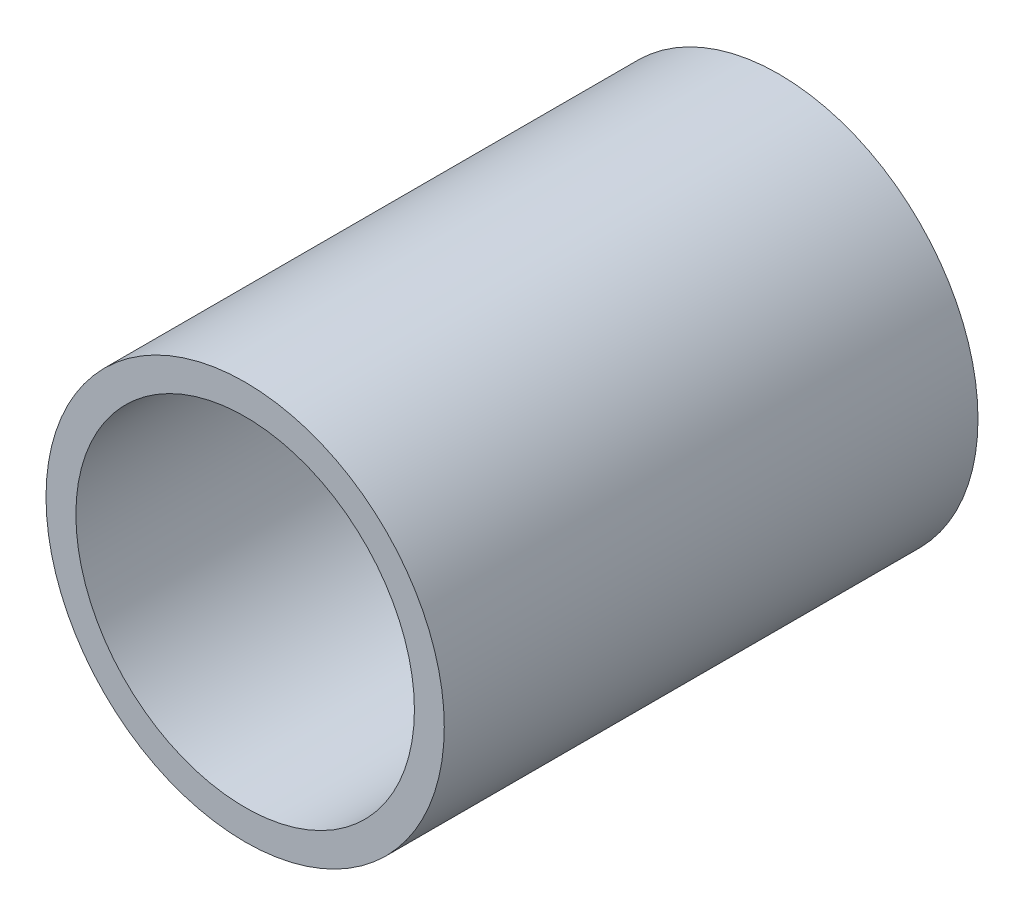
ISO-10303-21;
HEADER;
FILE_DESCRIPTION(('STEP AP214'),'2;1');
FILE_NAME('part.step','',(''),(''),'','','');
FILE_SCHEMA(('AUTOMOTIVE_DESIGN { 1 0 10303 214 1 1 1 1 }'));
ENDSEC;
DATA;
#1=APPLICATION_CONTEXT('core data for automotive mechanical design processes');
#2=APPLICATION_PROTOCOL_DEFINITION('international standard','automotive_design',2000,#1);
#3=PRODUCT_CONTEXT('',#1,'mechanical');
#4=PRODUCT('Part','Part','',(#3));
#5=PRODUCT_RELATED_PRODUCT_CATEGORY('part','',(#4));
#6=PRODUCT_DEFINITION_FORMATION('','',#4);
#7=PRODUCT_DEFINITION_CONTEXT('part definition',#1,'design');
#8=PRODUCT_DEFINITION('design','',#6,#7);
#9=PRODUCT_DEFINITION_SHAPE('','',#8);
#10=(LENGTH_UNIT() NAMED_UNIT(*) SI_UNIT(.MILLI.,.METRE.));
#11=(NAMED_UNIT(*) PLANE_ANGLE_UNIT() SI_UNIT($,.RADIAN.));
#12=(NAMED_UNIT(*) SI_UNIT($,.STERADIAN.) SOLID_ANGLE_UNIT());
#13=UNCERTAINTY_MEASURE_WITH_UNIT(LENGTH_MEASURE(1.E-05),#10,'distance_accuracy_value','');
#14=(GEOMETRIC_REPRESENTATION_CONTEXT(3) GLOBAL_UNCERTAINTY_ASSIGNED_CONTEXT((#13)) GLOBAL_UNIT_ASSIGNED_CONTEXT((#10,
#11,#12)) REPRESENTATION_CONTEXT('',''));
#15=CARTESIAN_POINT('',(0.,0.,0.));
#16=DIRECTION('',(0.,0.,1.));
#17=DIRECTION('',(1.,0.,0.));
#18=AXIS2_PLACEMENT_3D('',#15,#16,#17);
#19=CARTESIAN_POINT('',(0.,0.,134.));
#20=DIRECTION('',(0.,0.,1.));
#21=DIRECTION('',(1.,0.,0.));
#22=AXIS2_PLACEMENT_3D('',#19,#20,#21);
#23=PLANE('',#22);
#24=CARTESIAN_POINT('',(0.,0.,134.));
#25=DIRECTION('',(0.,0.,1.));
#26=DIRECTION('',(1.,0.,0.));
#27=AXIS2_PLACEMENT_3D('',#24,#25,#26);
#28=CIRCLE('',#27,50.);
#29=CARTESIAN_POINT('',(50.,0.,134.));
#30=VERTEX_POINT('',#29);
#31=EDGE_CURVE('E10',#30,#30,#28,.T.);
#32=ORIENTED_EDGE('',*,*,#31,.T.);
#33=EDGE_LOOP('',(#32));
#34=FACE_BOUND('',#33,.T.);
#35=CARTESIAN_POINT('',(0.,0.,134.));
#36=DIRECTION('',(0.,0.,1.));
#37=DIRECTION('',(1.,0.,0.));
#38=AXIS2_PLACEMENT_3D('',#35,#36,#37);
#39=CIRCLE('',#38,42.5);
#40=CARTESIAN_POINT('',(42.5,0.,134.));
#41=VERTEX_POINT('',#40);
#42=EDGE_CURVE('E50',#41,#41,#39,.T.);
#43=ORIENTED_EDGE('',*,*,#42,.F.);
#44=EDGE_LOOP('',(#43));
#45=FACE_BOUND('',#44,.T.);
#46=ADVANCED_FACE('F37',(#34,#45),#23,.T.);
#47=CARTESIAN_POINT('',(0.,0.,0.));
#48=DIRECTION('',(0.,0.,1.));
#49=DIRECTION('',(1.,0.,0.));
#50=AXIS2_PLACEMENT_3D('',#47,#48,#49);
#51=PLANE('',#50);
#52=CARTESIAN_POINT('',(0.,0.,0.));
#53=DIRECTION('',(0.,0.,1.));
#54=DIRECTION('',(1.,0.,0.));
#55=AXIS2_PLACEMENT_3D('',#52,#53,#54);
#56=CIRCLE('',#55,50.);
#57=CARTESIAN_POINT('',(50.,0.,0.));
#58=VERTEX_POINT('',#57);
#59=EDGE_CURVE('E41',#58,#58,#56,.T.);
#60=ORIENTED_EDGE('',*,*,#59,.F.);
#61=EDGE_LOOP('',(#60));
#62=FACE_BOUND('',#61,.T.);
#63=CARTESIAN_POINT('',(0.,0.,0.));
#64=DIRECTION('',(0.,0.,1.));
#65=DIRECTION('',(1.,0.,0.));
#66=AXIS2_PLACEMENT_3D('',#63,#64,#65);
#67=CIRCLE('',#66,42.5);
#68=CARTESIAN_POINT('',(42.5,0.,0.));
#69=VERTEX_POINT('',#68);
#70=EDGE_CURVE('E52',#69,#69,#67,.T.);
#71=ORIENTED_EDGE('',*,*,#70,.T.);
#72=EDGE_LOOP('',(#71));
#73=FACE_BOUND('',#72,.T.);
#74=ADVANCED_FACE('F64',(#62,#73),#51,.F.);
#75=CARTESIAN_POINT('',(0.,0.,134.));
#76=DIRECTION('',(0.,0.,-1.));
#77=DIRECTION('',(-1.,0.,0.));
#78=AXIS2_PLACEMENT_3D('',#75,#76,#77);
#79=CYLINDRICAL_SURFACE('',#78,50.);
#80=ORIENTED_EDGE('',*,*,#31,.F.);
#81=EDGE_LOOP('',(#80));
#82=FACE_BOUND('',#81,.T.);
#83=ORIENTED_EDGE('',*,*,#59,.T.);
#84=EDGE_LOOP('',(#83));
#85=FACE_BOUND('',#84,.T.);
#86=ADVANCED_FACE('F39',(#82,#85),#79,.T.);
#87=CARTESIAN_POINT('',(0.,0.,134.));
#88=DIRECTION('',(0.,0.,-1.));
#89=DIRECTION('',(-1.,0.,0.));
#90=AXIS2_PLACEMENT_3D('',#87,#88,#89);
#91=CYLINDRICAL_SURFACE('',#90,42.5);
#92=ORIENTED_EDGE('',*,*,#42,.T.);
#93=EDGE_LOOP('',(#92));
#94=FACE_BOUND('',#93,.T.);
#95=ORIENTED_EDGE('',*,*,#70,.F.);
#96=EDGE_LOOP('',(#95));
#97=FACE_BOUND('',#96,.T.);
#98=ADVANCED_FACE('F60',(#94,#97),#91,.F.);
#99=CLOSED_SHELL('',(#46,#74,#86,#98));
#100=MANIFOLD_SOLID_BREP('B2',#99);
#101=ADVANCED_BREP_SHAPE_REPRESENTATION('',(#18,#100),#14);
#102=SHAPE_DEFINITION_REPRESENTATION(#9,#101);
ENDSEC;
END-ISO-10303-21;
